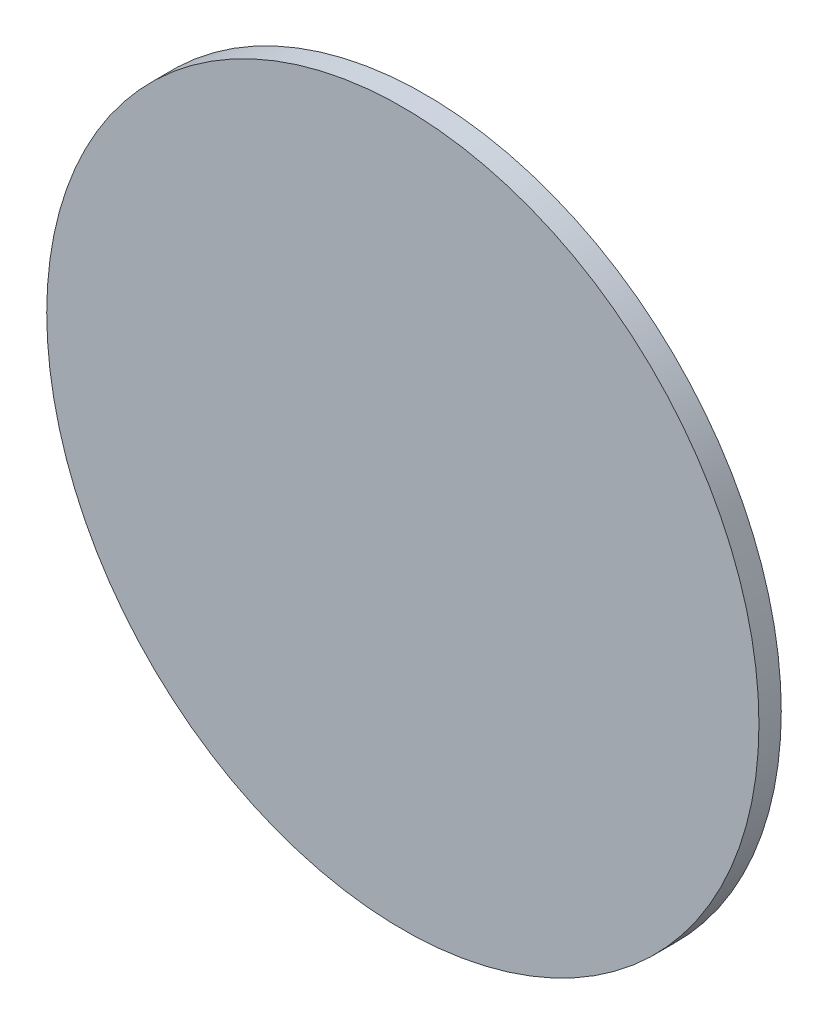
ISO-10303-21;
HEADER;
FILE_DESCRIPTION(('STEP AP214'),'2;1');
FILE_NAME('part.step','',(''),(''),'','','');
FILE_SCHEMA(('AUTOMOTIVE_DESIGN { 1 0 10303 214 1 1 1 1 }'));
ENDSEC;
DATA;
#1=APPLICATION_CONTEXT('core data for automotive mechanical design processes');
#2=APPLICATION_PROTOCOL_DEFINITION('international standard','automotive_design',2000,#1);
#3=PRODUCT_CONTEXT('',#1,'mechanical');
#4=PRODUCT('Part','Part','',(#3));
#5=PRODUCT_RELATED_PRODUCT_CATEGORY('part','',(#4));
#6=PRODUCT_DEFINITION_FORMATION('','',#4);
#7=PRODUCT_DEFINITION_CONTEXT('part definition',#1,'design');
#8=PRODUCT_DEFINITION('design','',#6,#7);
#9=PRODUCT_DEFINITION_SHAPE('','',#8);
#10=(LENGTH_UNIT() NAMED_UNIT(*) SI_UNIT(.MILLI.,.METRE.));
#11=(NAMED_UNIT(*) PLANE_ANGLE_UNIT() SI_UNIT($,.RADIAN.));
#12=(NAMED_UNIT(*) SI_UNIT($,.STERADIAN.) SOLID_ANGLE_UNIT());
#13=UNCERTAINTY_MEASURE_WITH_UNIT(LENGTH_MEASURE(1.E-05),#10,'distance_accuracy_value','');
#14=(GEOMETRIC_REPRESENTATION_CONTEXT(3) GLOBAL_UNCERTAINTY_ASSIGNED_CONTEXT((#13)) GLOBAL_UNIT_ASSIGNED_CONTEXT((#10,
#11,#12)) REPRESENTATION_CONTEXT('',''));
#15=CARTESIAN_POINT('',(0.,0.,0.));
#16=DIRECTION('',(0.,0.,1.));
#17=DIRECTION('',(1.,0.,0.));
#18=AXIS2_PLACEMENT_3D('',#15,#16,#17);
#19=CARTESIAN_POINT('',(0.,0.,1.));
#20=DIRECTION('',(0.,0.,-1.));
#21=DIRECTION('',(-1.,0.,0.));
#22=AXIS2_PLACEMENT_3D('',#19,#20,#21);
#23=CYLINDRICAL_SURFACE('',#22,15.95);
#24=CARTESIAN_POINT('',(0.,0.,1.));
#25=DIRECTION('',(0.,0.,1.));
#26=DIRECTION('',(1.,0.,0.));
#27=AXIS2_PLACEMENT_3D('',#24,#25,#26);
#28=CIRCLE('',#27,15.95);
#29=CARTESIAN_POINT('',(15.95,0.,1.));
#30=VERTEX_POINT('',#29);
#31=EDGE_CURVE('E10',#30,#30,#28,.T.);
#32=ORIENTED_EDGE('',*,*,#31,.F.);
#33=EDGE_LOOP('',(#32));
#34=FACE_BOUND('',#33,.T.);
#35=CARTESIAN_POINT('',(0.,0.,0.));
#36=DIRECTION('',(0.,0.,1.));
#37=DIRECTION('',(1.,0.,0.));
#38=AXIS2_PLACEMENT_3D('',#35,#36,#37);
#39=CIRCLE('',#38,15.95);
#40=CARTESIAN_POINT('',(15.95,0.,0.));
#41=VERTEX_POINT('',#40);
#42=EDGE_CURVE('E33',#41,#41,#39,.T.);
#43=ORIENTED_EDGE('',*,*,#42,.T.);
#44=EDGE_LOOP('',(#43));
#45=FACE_BOUND('',#44,.T.);
#46=ADVANCED_FACE('F30',(#34,#45),#23,.T.);
#47=CARTESIAN_POINT('',(0.,0.,1.));
#48=DIRECTION('',(0.,0.,1.));
#49=DIRECTION('',(1.,0.,0.));
#50=AXIS2_PLACEMENT_3D('',#47,#48,#49);
#51=PLANE('',#50);
#52=ORIENTED_EDGE('',*,*,#31,.T.);
#53=EDGE_LOOP('',(#52));
#54=FACE_BOUND('',#53,.T.);
#55=ADVANCED_FACE('F45',(#54),#51,.T.);
#56=CARTESIAN_POINT('',(0.,0.,0.));
#57=DIRECTION('',(0.,0.,1.));
#58=DIRECTION('',(1.,0.,0.));
#59=AXIS2_PLACEMENT_3D('',#56,#57,#58);
#60=PLANE('',#59);
#61=ORIENTED_EDGE('',*,*,#42,.F.);
#62=EDGE_LOOP('',(#61));
#63=FACE_BOUND('',#62,.T.);
#64=ADVANCED_FACE('F43',(#63),#60,.F.);
#65=CLOSED_SHELL('',(#46,#55,#64));
#66=MANIFOLD_SOLID_BREP('B2',#65);
#67=ADVANCED_BREP_SHAPE_REPRESENTATION('',(#18,#66),#14);
#68=SHAPE_DEFINITION_REPRESENTATION(#9,#67);
ENDSEC;
END-ISO-10303-21;
